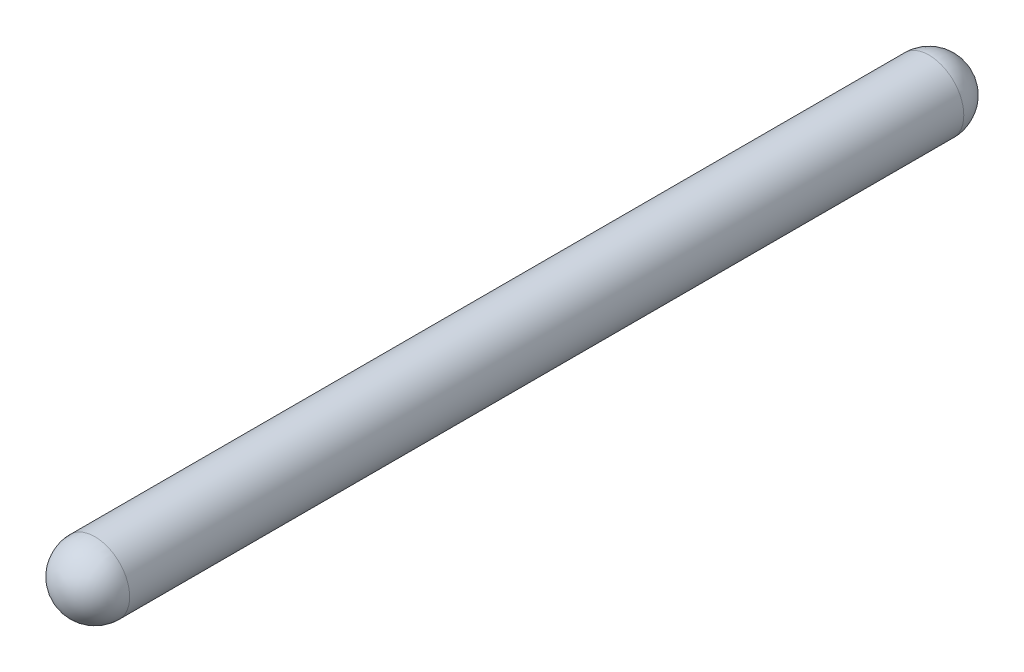
ISO-10303-21;
HEADER;
FILE_DESCRIPTION(('STEP AP214'),'2;1');
FILE_NAME('part.step','',(''),(''),'','','');
FILE_SCHEMA(('AUTOMOTIVE_DESIGN { 1 0 10303 214 1 1 1 1 }'));
ENDSEC;
DATA;
#1=APPLICATION_CONTEXT('core data for automotive mechanical design processes');
#2=APPLICATION_PROTOCOL_DEFINITION('international standard','automotive_design',2000,#1);
#3=PRODUCT_CONTEXT('',#1,'mechanical');
#4=PRODUCT('Part','Part','',(#3));
#5=PRODUCT_RELATED_PRODUCT_CATEGORY('part','',(#4));
#6=PRODUCT_DEFINITION_FORMATION('','',#4);
#7=PRODUCT_DEFINITION_CONTEXT('part definition',#1,'design');
#8=PRODUCT_DEFINITION('design','',#6,#7);
#9=PRODUCT_DEFINITION_SHAPE('','',#8);
#10=(LENGTH_UNIT() NAMED_UNIT(*) SI_UNIT(.MILLI.,.METRE.));
#11=(NAMED_UNIT(*) PLANE_ANGLE_UNIT() SI_UNIT($,.RADIAN.));
#12=(NAMED_UNIT(*) SI_UNIT($,.STERADIAN.) SOLID_ANGLE_UNIT());
#13=UNCERTAINTY_MEASURE_WITH_UNIT(LENGTH_MEASURE(1.E-05),#10,'distance_accuracy_value','');
#14=(GEOMETRIC_REPRESENTATION_CONTEXT(3) GLOBAL_UNCERTAINTY_ASSIGNED_CONTEXT((#13)) GLOBAL_UNIT_ASSIGNED_CONTEXT((#10,
#11,#12)) REPRESENTATION_CONTEXT('',''));
#15=CARTESIAN_POINT('',(0.,0.,0.));
#16=DIRECTION('',(0.,0.,1.));
#17=DIRECTION('',(1.,0.,0.));
#18=AXIS2_PLACEMENT_3D('',#15,#16,#17);
#19=CARTESIAN_POINT('',(0.,2.54,-3.));
#20=DIRECTION('',(1.,0.,0.));
#21=DIRECTION('',(0.,-1.,0.));
#22=AXIS2_PLACEMENT_3D('',#19,#20,#21);
#23=SPHERICAL_SURFACE('',#22,0.458);
#24=CARTESIAN_POINT('',(0.,2.54,-3.));
#25=DIRECTION('',(0.,0.,1.));
#26=DIRECTION('',(1.,0.,0.));
#27=AXIS2_PLACEMENT_3D('',#24,#25,#26);
#28=CIRCLE('',#27,0.458);
#29=CARTESIAN_POINT('',(0.458,2.54,-3.));
#30=VERTEX_POINT('',#29);
#31=CARTESIAN_POINT('',(-0.458,2.54,-3.));
#32=VERTEX_POINT('',#31);
#33=EDGE_CURVE('E42',#30,#32,#28,.T.);
#34=ORIENTED_EDGE('',*,*,#33,.F.);
#35=CARTESIAN_POINT('',(0.,2.54,-3.));
#36=DIRECTION('',(0.,0.,1.));
#37=DIRECTION('',(1.,0.,0.));
#38=AXIS2_PLACEMENT_3D('',#35,#36,#37);
#39=CIRCLE('',#38,0.458);
#40=EDGE_CURVE('E26',#32,#30,#39,.T.);
#41=ORIENTED_EDGE('',*,*,#40,.F.);
#42=EDGE_LOOP('',(#34,#41));
#43=FACE_BOUND('',#42,.T.);
#44=ADVANCED_FACE('F17',(#43),#23,.T.);
#45=CARTESIAN_POINT('',(0.,2.54,8.));
#46=DIRECTION('',(1.,0.,0.));
#47=DIRECTION('',(0.,1.,0.));
#48=AXIS2_PLACEMENT_3D('',#45,#46,#47);
#49=SPHERICAL_SURFACE('',#48,0.458);
#50=CARTESIAN_POINT('',(0.,2.54,8.));
#51=DIRECTION('',(0.,0.,1.));
#52=DIRECTION('',(1.,0.,0.));
#53=AXIS2_PLACEMENT_3D('',#50,#51,#52);
#54=CIRCLE('',#53,0.458);
#55=CARTESIAN_POINT('',(0.458,2.54,8.));
#56=VERTEX_POINT('',#55);
#57=CARTESIAN_POINT('',(-0.458,2.54,8.));
#58=VERTEX_POINT('',#57);
#59=EDGE_CURVE('E11',#56,#58,#54,.F.);
#60=ORIENTED_EDGE('',*,*,#59,.F.);
#61=CARTESIAN_POINT('',(0.,2.54,8.));
#62=DIRECTION('',(0.,0.,1.));
#63=DIRECTION('',(1.,0.,0.));
#64=AXIS2_PLACEMENT_3D('',#61,#62,#63);
#65=CIRCLE('',#64,0.458);
#66=EDGE_CURVE('E34',#58,#56,#65,.F.);
#67=ORIENTED_EDGE('',*,*,#66,.F.);
#68=EDGE_LOOP('',(#60,#67));
#69=FACE_BOUND('',#68,.T.);
#70=ADVANCED_FACE('F49',(#69),#49,.T.);
#71=CARTESIAN_POINT('',(0.,2.54,-3.));
#72=DIRECTION('',(0.,0.,1.));
#73=DIRECTION('',(1.,0.,0.));
#74=AXIS2_PLACEMENT_3D('',#71,#72,#73);
#75=CYLINDRICAL_SURFACE('',#74,0.458);
#76=ORIENTED_EDGE('',*,*,#66,.T.);
#77=ORIENTED_EDGE('',*,*,#59,.T.);
#78=EDGE_LOOP('',(#76,#77));
#79=FACE_BOUND('',#78,.T.);
#80=ORIENTED_EDGE('',*,*,#40,.T.);
#81=ORIENTED_EDGE('',*,*,#33,.T.);
#82=EDGE_LOOP('',(#80,#81));
#83=FACE_BOUND('',#82,.T.);
#84=ADVANCED_FACE('F45',(#79,#83),#75,.T.);
#85=CLOSED_SHELL('',(#44,#70,#84));
#86=MANIFOLD_SOLID_BREP('B1',#85);
#87=ADVANCED_BREP_SHAPE_REPRESENTATION('',(#18,#86),#14);
#88=SHAPE_DEFINITION_REPRESENTATION(#9,#87);
ENDSEC;
END-ISO-10303-21;
